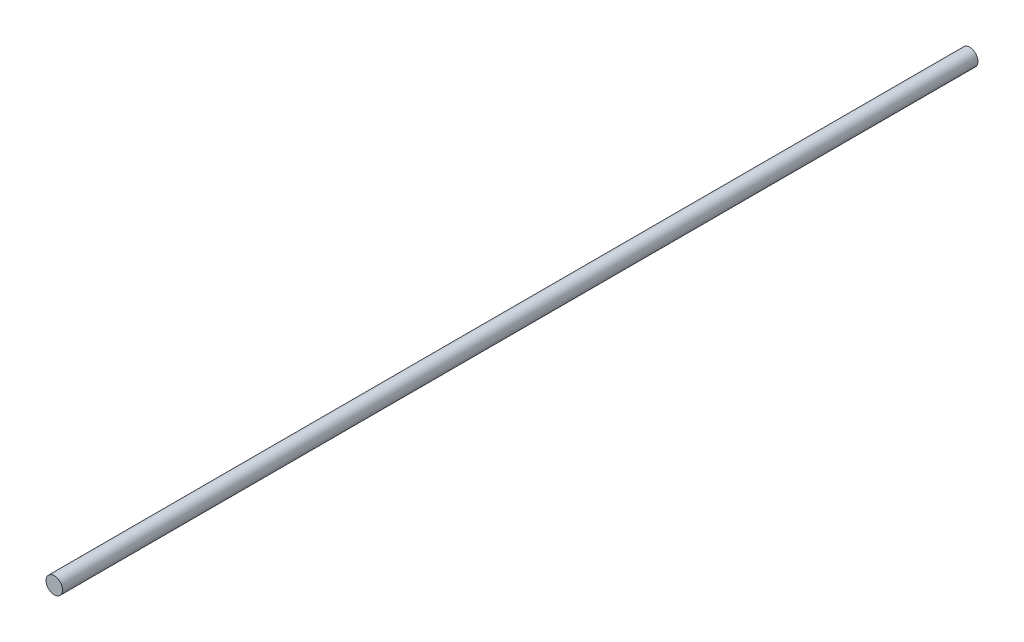
ISO-10303-21;
HEADER;
FILE_DESCRIPTION(('STEP AP214'),'2;1');
FILE_NAME('part.step','',(''),(''),'','','');
FILE_SCHEMA(('AUTOMOTIVE_DESIGN { 1 0 10303 214 1 1 1 1 }'));
ENDSEC;
DATA;
#1=APPLICATION_CONTEXT('core data for automotive mechanical design processes');
#2=APPLICATION_PROTOCOL_DEFINITION('international standard','automotive_design',2000,#1);
#3=PRODUCT_CONTEXT('',#1,'mechanical');
#4=PRODUCT('Part','Part','',(#3));
#5=PRODUCT_RELATED_PRODUCT_CATEGORY('part','',(#4));
#6=PRODUCT_DEFINITION_FORMATION('','',#4);
#7=PRODUCT_DEFINITION_CONTEXT('part definition',#1,'design');
#8=PRODUCT_DEFINITION('design','',#6,#7);
#9=PRODUCT_DEFINITION_SHAPE('','',#8);
#10=(LENGTH_UNIT() NAMED_UNIT(*) SI_UNIT(.MILLI.,.METRE.));
#11=(NAMED_UNIT(*) PLANE_ANGLE_UNIT() SI_UNIT($,.RADIAN.));
#12=(NAMED_UNIT(*) SI_UNIT($,.STERADIAN.) SOLID_ANGLE_UNIT());
#13=UNCERTAINTY_MEASURE_WITH_UNIT(LENGTH_MEASURE(1.E-05),#10,'distance_accuracy_value','');
#14=(GEOMETRIC_REPRESENTATION_CONTEXT(3) GLOBAL_UNCERTAINTY_ASSIGNED_CONTEXT((#13)) GLOBAL_UNIT_ASSIGNED_CONTEXT((#10,
#11,#12)) REPRESENTATION_CONTEXT('',''));
#15=CARTESIAN_POINT('',(0.,0.,0.));
#16=DIRECTION('',(0.,0.,1.));
#17=DIRECTION('',(1.,0.,0.));
#18=AXIS2_PLACEMENT_3D('',#15,#16,#17);
#19=CARTESIAN_POINT('',(0.,0.,830.));
#20=DIRECTION('',(0.,0.,-1.));
#21=DIRECTION('',(-1.,0.,0.));
#22=AXIS2_PLACEMENT_3D('',#19,#20,#21);
#23=CYLINDRICAL_SURFACE('',#22,7.5);
#24=CARTESIAN_POINT('',(0.,0.,830.));
#25=DIRECTION('',(0.,0.,1.));
#26=DIRECTION('',(1.,0.,0.));
#27=AXIS2_PLACEMENT_3D('',#24,#25,#26);
#28=CIRCLE('',#27,7.5);
#29=CARTESIAN_POINT('',(7.5,0.,830.));
#30=VERTEX_POINT('',#29);
#31=EDGE_CURVE('E10',#30,#30,#28,.T.);
#32=ORIENTED_EDGE('',*,*,#31,.F.);
#33=EDGE_LOOP('',(#32));
#34=FACE_BOUND('',#33,.T.);
#35=CARTESIAN_POINT('',(0.,0.,0.));
#36=DIRECTION('',(0.,0.,1.));
#37=DIRECTION('',(1.,0.,0.));
#38=AXIS2_PLACEMENT_3D('',#35,#36,#37);
#39=CIRCLE('',#38,7.5);
#40=CARTESIAN_POINT('',(7.5,0.,0.));
#41=VERTEX_POINT('',#40);
#42=EDGE_CURVE('E38',#41,#41,#39,.T.);
#43=ORIENTED_EDGE('',*,*,#42,.T.);
#44=EDGE_LOOP('',(#43));
#45=FACE_BOUND('',#44,.T.);
#46=ADVANCED_FACE('F35',(#34,#45),#23,.T.);
#47=CARTESIAN_POINT('',(0.,0.,830.));
#48=DIRECTION('',(0.,0.,1.));
#49=DIRECTION('',(1.,0.,0.));
#50=AXIS2_PLACEMENT_3D('',#47,#48,#49);
#51=PLANE('',#50);
#52=ORIENTED_EDGE('',*,*,#31,.T.);
#53=EDGE_LOOP('',(#52));
#54=FACE_BOUND('',#53,.T.);
#55=ADVANCED_FACE('F50',(#54),#51,.T.);
#56=CARTESIAN_POINT('',(0.,0.,0.));
#57=DIRECTION('',(0.,0.,1.));
#58=DIRECTION('',(1.,0.,0.));
#59=AXIS2_PLACEMENT_3D('',#56,#57,#58);
#60=PLANE('',#59);
#61=ORIENTED_EDGE('',*,*,#42,.F.);
#62=EDGE_LOOP('',(#61));
#63=FACE_BOUND('',#62,.T.);
#64=ADVANCED_FACE('F48',(#63),#60,.F.);
#65=CLOSED_SHELL('',(#46,#55,#64));
#66=MANIFOLD_SOLID_BREP('B2',#65);
#67=ADVANCED_BREP_SHAPE_REPRESENTATION('',(#18,#66),#14);
#68=SHAPE_DEFINITION_REPRESENTATION(#9,#67);
ENDSEC;
END-ISO-10303-21;
